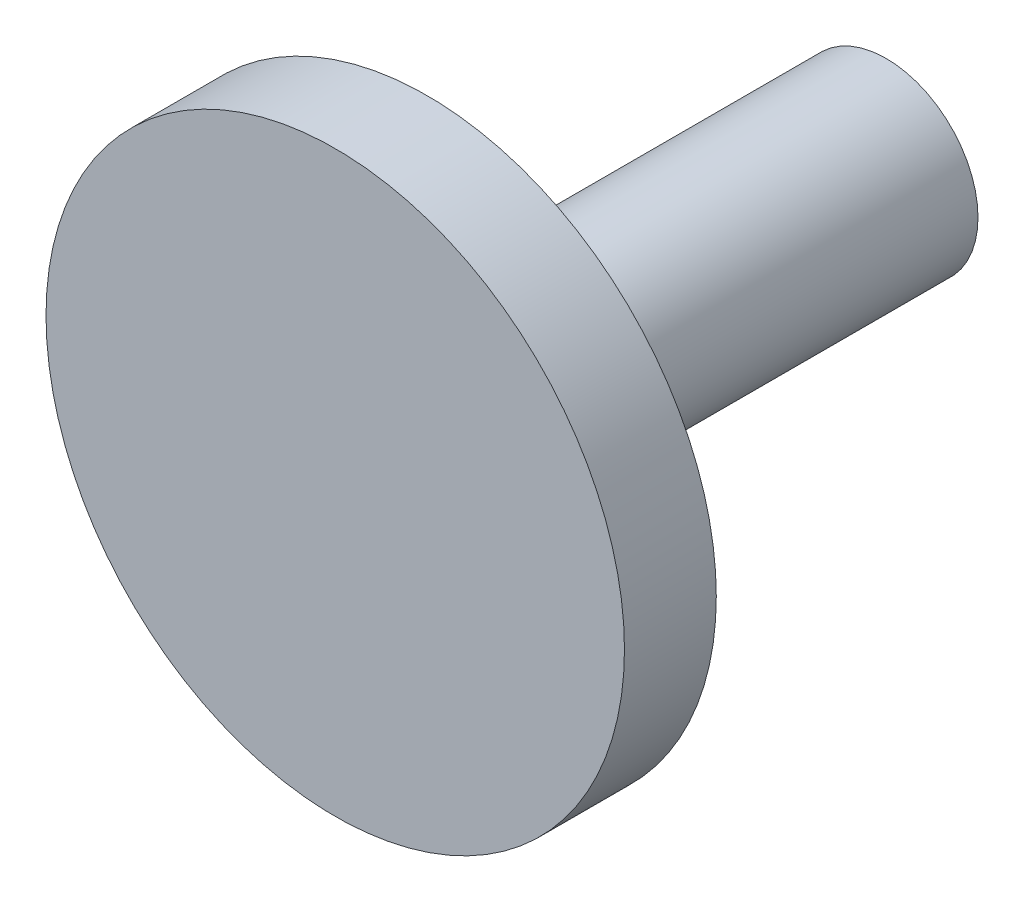
ISO-10303-21;
HEADER;
FILE_DESCRIPTION(('STEP AP214'),'2;1');
FILE_NAME('part.step','',(''),(''),'','','');
FILE_SCHEMA(('AUTOMOTIVE_DESIGN { 1 0 10303 214 1 1 1 1 }'));
ENDSEC;
DATA;
#1=APPLICATION_CONTEXT('core data for automotive mechanical design processes');
#2=APPLICATION_PROTOCOL_DEFINITION('international standard','automotive_design',2000,#1);
#3=PRODUCT_CONTEXT('',#1,'mechanical');
#4=PRODUCT('Part','Part','',(#3));
#5=PRODUCT_RELATED_PRODUCT_CATEGORY('part','',(#4));
#6=PRODUCT_DEFINITION_FORMATION('','',#4);
#7=PRODUCT_DEFINITION_CONTEXT('part definition',#1,'design');
#8=PRODUCT_DEFINITION('design','',#6,#7);
#9=PRODUCT_DEFINITION_SHAPE('','',#8);
#10=(LENGTH_UNIT() NAMED_UNIT(*) SI_UNIT(.MILLI.,.METRE.));
#11=(NAMED_UNIT(*) PLANE_ANGLE_UNIT() SI_UNIT($,.RADIAN.));
#12=(NAMED_UNIT(*) SI_UNIT($,.STERADIAN.) SOLID_ANGLE_UNIT());
#13=UNCERTAINTY_MEASURE_WITH_UNIT(LENGTH_MEASURE(1.E-05),#10,'distance_accuracy_value','');
#14=(GEOMETRIC_REPRESENTATION_CONTEXT(3) GLOBAL_UNCERTAINTY_ASSIGNED_CONTEXT((#13)) GLOBAL_UNIT_ASSIGNED_CONTEXT((#10,
#11,#12)) REPRESENTATION_CONTEXT('',''));
#15=CARTESIAN_POINT('',(0.,0.,0.));
#16=DIRECTION('',(0.,0.,1.));
#17=DIRECTION('',(1.,0.,0.));
#18=AXIS2_PLACEMENT_3D('',#15,#16,#17);
#19=CARTESIAN_POINT('',(0.,0.,5.));
#20=DIRECTION('',(0.,0.,-1.));
#21=DIRECTION('',(-1.,0.,0.));
#22=AXIS2_PLACEMENT_3D('',#19,#20,#21);
#23=CYLINDRICAL_SURFACE('',#22,15.75);
#24=CARTESIAN_POINT('',(0.,0.,5.));
#25=DIRECTION('',(0.,0.,1.));
#26=DIRECTION('',(1.,0.,0.));
#27=AXIS2_PLACEMENT_3D('',#24,#25,#26);
#28=CIRCLE('',#27,15.75);
#29=CARTESIAN_POINT('',(15.75,0.,5.));
#30=VERTEX_POINT('',#29);
#31=EDGE_CURVE('E10',#30,#30,#28,.T.);
#32=ORIENTED_EDGE('',*,*,#31,.F.);
#33=EDGE_LOOP('',(#32));
#34=FACE_BOUND('',#33,.T.);
#35=CARTESIAN_POINT('',(0.,0.,0.));
#36=DIRECTION('',(0.,0.,1.));
#37=DIRECTION('',(1.,0.,0.));
#38=AXIS2_PLACEMENT_3D('',#35,#36,#37);
#39=CIRCLE('',#38,15.75);
#40=CARTESIAN_POINT('',(15.75,0.,0.));
#41=VERTEX_POINT('',#40);
#42=EDGE_CURVE('E34',#41,#41,#39,.T.);
#43=ORIENTED_EDGE('',*,*,#42,.T.);
#44=EDGE_LOOP('',(#43));
#45=FACE_BOUND('',#44,.T.);
#46=ADVANCED_FACE('F31',(#34,#45),#23,.T.);
#47=CARTESIAN_POINT('',(0.,0.,5.));
#48=DIRECTION('',(0.,0.,1.));
#49=DIRECTION('',(1.,0.,0.));
#50=AXIS2_PLACEMENT_3D('',#47,#48,#49);
#51=PLANE('',#50);
#52=ORIENTED_EDGE('',*,*,#31,.T.);
#53=EDGE_LOOP('',(#52));
#54=FACE_BOUND('',#53,.T.);
#55=ADVANCED_FACE('F61',(#54),#51,.T.);
#56=CARTESIAN_POINT('',(0.,0.,0.));
#57=DIRECTION('',(0.,0.,1.));
#58=DIRECTION('',(1.,0.,0.));
#59=AXIS2_PLACEMENT_3D('',#56,#57,#58);
#60=PLANE('',#59);
#61=CARTESIAN_POINT('',(0.,0.,0.));
#62=DIRECTION('',(0.,0.,1.));
#63=DIRECTION('',(1.,0.,0.));
#64=AXIS2_PLACEMENT_3D('',#61,#62,#63);
#65=CIRCLE('',#64,5.);
#66=CARTESIAN_POINT('',(5.,0.,0.));
#67=VERTEX_POINT('',#66);
#68=EDGE_CURVE('E43',#67,#67,#65,.T.);
#69=ORIENTED_EDGE('',*,*,#68,.T.);
#70=EDGE_LOOP('',(#69));
#71=FACE_BOUND('',#70,.T.);
#72=ORIENTED_EDGE('',*,*,#42,.F.);
#73=EDGE_LOOP('',(#72));
#74=FACE_BOUND('',#73,.T.);
#75=ADVANCED_FACE('F58',(#71,#74),#60,.F.);
#76=CARTESIAN_POINT('',(0.,0.,-25.));
#77=DIRECTION('',(0.,0.,1.));
#78=DIRECTION('',(1.,0.,0.));
#79=AXIS2_PLACEMENT_3D('',#76,#77,#78);
#80=CYLINDRICAL_SURFACE('',#79,5.);
#81=CARTESIAN_POINT('',(0.,0.,-25.));
#82=DIRECTION('',(0.,0.,1.));
#83=DIRECTION('',(1.,0.,0.));
#84=AXIS2_PLACEMENT_3D('',#81,#82,#83);
#85=CIRCLE('',#84,5.);
#86=CARTESIAN_POINT('',(5.,0.,-25.));
#87=VERTEX_POINT('',#86);
#88=EDGE_CURVE('E41',#87,#87,#85,.T.);
#89=ORIENTED_EDGE('',*,*,#88,.T.);
#90=EDGE_LOOP('',(#89));
#91=FACE_BOUND('',#90,.T.);
#92=ORIENTED_EDGE('',*,*,#68,.F.);
#93=EDGE_LOOP('',(#92));
#94=FACE_BOUND('',#93,.T.);
#95=ADVANCED_FACE('F49',(#91,#94),#80,.T.);
#96=CARTESIAN_POINT('',(0.,0.,-25.));
#97=DIRECTION('',(0.,0.,1.));
#98=DIRECTION('',(1.,0.,0.));
#99=AXIS2_PLACEMENT_3D('',#96,#97,#98);
#100=PLANE('',#99);
#101=ORIENTED_EDGE('',*,*,#88,.F.);
#102=EDGE_LOOP('',(#101));
#103=FACE_BOUND('',#102,.T.);
#104=ADVANCED_FACE('F52',(#103),#100,.F.);
#105=CLOSED_SHELL('',(#46,#55,#75,#95,#104));
#106=MANIFOLD_SOLID_BREP('B2',#105);
#107=ADVANCED_BREP_SHAPE_REPRESENTATION('',(#18,#106),#14);
#108=SHAPE_DEFINITION_REPRESENTATION(#9,#107);
ENDSEC;
END-ISO-10303-21;
